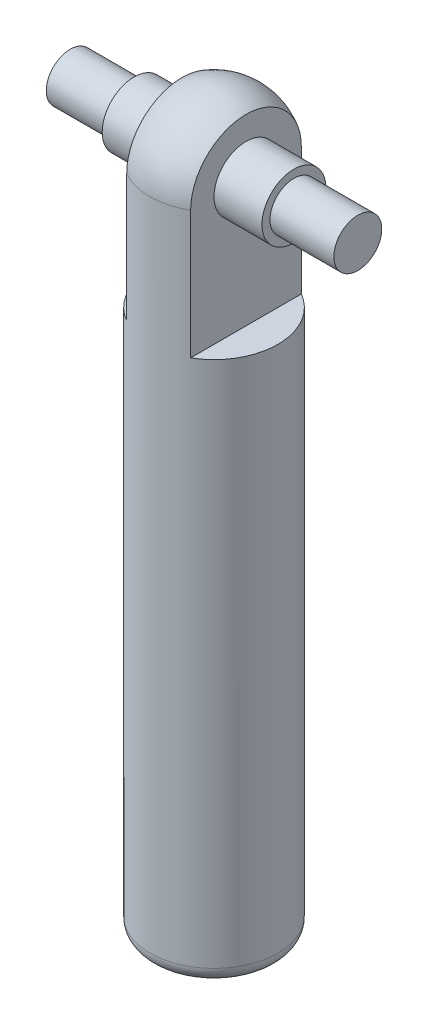
ISO-10303-21;
HEADER;
FILE_DESCRIPTION(('STEP AP214'),'2;1');
FILE_NAME('part.step','',(''),(''),'','','');
FILE_SCHEMA(('AUTOMOTIVE_DESIGN { 1 0 10303 214 1 1 1 1 }'));
ENDSEC;
DATA;
#1=APPLICATION_CONTEXT('core data for automotive mechanical design processes');
#2=APPLICATION_PROTOCOL_DEFINITION('international standard','automotive_design',2000,#1);
#3=PRODUCT_CONTEXT('',#1,'mechanical');
#4=PRODUCT('Part','Part','',(#3));
#5=PRODUCT_RELATED_PRODUCT_CATEGORY('part','',(#4));
#6=PRODUCT_DEFINITION_FORMATION('','',#4);
#7=PRODUCT_DEFINITION_CONTEXT('part definition',#1,'design');
#8=PRODUCT_DEFINITION('design','',#6,#7);
#9=PRODUCT_DEFINITION_SHAPE('','',#8);
#10=(LENGTH_UNIT() NAMED_UNIT(*) SI_UNIT(.MILLI.,.METRE.));
#11=(NAMED_UNIT(*) PLANE_ANGLE_UNIT() SI_UNIT($,.RADIAN.));
#12=(NAMED_UNIT(*) SI_UNIT($,.STERADIAN.) SOLID_ANGLE_UNIT());
#13=UNCERTAINTY_MEASURE_WITH_UNIT(LENGTH_MEASURE(1.E-05),#10,'distance_accuracy_value','');
#14=(GEOMETRIC_REPRESENTATION_CONTEXT(3) GLOBAL_UNCERTAINTY_ASSIGNED_CONTEXT((#13)) GLOBAL_UNIT_ASSIGNED_CONTEXT((#10,
#11,#12)) REPRESENTATION_CONTEXT('',''));
#15=CARTESIAN_POINT('',(0.,0.,0.));
#16=DIRECTION('',(0.,0.,1.));
#17=DIRECTION('',(1.,0.,0.));
#18=AXIS2_PLACEMENT_3D('',#15,#16,#17);
#19=CARTESIAN_POINT('',(-9.,1.5,0.));
#20=DIRECTION('',(1.,0.,0.));
#21=DIRECTION('',(0.,0.,-1.));
#22=AXIS2_PLACEMENT_3D('',#19,#20,#21);
#23=PLANE('',#22);
#24=CARTESIAN_POINT('',(-9.,0.,0.));
#25=DIRECTION('',(-1.,0.,0.));
#26=DIRECTION('',(0.,0.,1.));
#27=AXIS2_PLACEMENT_3D('',#24,#25,#26);
#28=CIRCLE('',#27,1.5);
#29=CARTESIAN_POINT('',(-9.,0.,1.5));
#30=VERTEX_POINT('',#29);
#31=EDGE_CURVE('E77',#30,#30,#28,.T.);
#32=ORIENTED_EDGE('',*,*,#31,.T.);
#33=EDGE_LOOP('',(#32));
#34=FACE_BOUND('',#33,.T.);
#35=ADVANCED_FACE('F55',(#34),#23,.F.);
#36=CARTESIAN_POINT('',(9.,0.,0.));
#37=DIRECTION('',(-1.,0.,0.));
#38=DIRECTION('',(0.,0.,1.));
#39=AXIS2_PLACEMENT_3D('',#36,#37,#38);
#40=PLANE('',#39);
#41=CARTESIAN_POINT('',(9.,0.,0.));
#42=DIRECTION('',(-1.,0.,0.));
#43=DIRECTION('',(0.,0.,1.));
#44=AXIS2_PLACEMENT_3D('',#41,#42,#43);
#45=CIRCLE('',#44,1.5);
#46=CARTESIAN_POINT('',(9.,0.,1.5));
#47=VERTEX_POINT('',#46);
#48=EDGE_CURVE('E11',#47,#47,#45,.T.);
#49=ORIENTED_EDGE('',*,*,#48,.F.);
#50=EDGE_LOOP('',(#49));
#51=FACE_BOUND('',#50,.T.);
#52=ADVANCED_FACE('F107',(#51),#40,.F.);
#53=CARTESIAN_POINT('',(-9.,0.,0.));
#54=DIRECTION('',(-1.,0.,0.));
#55=DIRECTION('',(0.,0.,1.));
#56=AXIS2_PLACEMENT_3D('',#53,#54,#55);
#57=CYLINDRICAL_SURFACE('',#56,1.5);
#58=CARTESIAN_POINT('',(5.,0.,0.));
#59=DIRECTION('',(-1.,0.,0.));
#60=DIRECTION('',(0.,0.,1.));
#61=AXIS2_PLACEMENT_3D('',#58,#59,#60);
#62=CIRCLE('',#61,1.5);
#63=CARTESIAN_POINT('',(5.,0.,1.5));
#64=VERTEX_POINT('',#63);
#65=EDGE_CURVE('E61',#64,#64,#62,.T.);
#66=ORIENTED_EDGE('',*,*,#65,.F.);
#67=EDGE_LOOP('',(#66));
#68=FACE_BOUND('',#67,.T.);
#69=ORIENTED_EDGE('',*,*,#48,.T.);
#70=EDGE_LOOP('',(#69));
#71=FACE_BOUND('',#70,.T.);
#72=ADVANCED_FACE('F102',(#68,#71),#57,.T.);
#73=CARTESIAN_POINT('',(5.,1.5,0.));
#74=DIRECTION('',(-1.,0.,0.));
#75=DIRECTION('',(0.,0.,1.));
#76=AXIS2_PLACEMENT_3D('',#73,#74,#75);
#77=PLANE('',#76);
#78=CARTESIAN_POINT('',(5.,0.,0.));
#79=DIRECTION('',(-1.,0.,0.));
#80=DIRECTION('',(0.,0.,1.));
#81=AXIS2_PLACEMENT_3D('',#78,#79,#80);
#82=CIRCLE('',#81,2.);
#83=CARTESIAN_POINT('',(5.,0.,2.));
#84=VERTEX_POINT('',#83);
#85=EDGE_CURVE('E65',#84,#84,#82,.T.);
#86=ORIENTED_EDGE('',*,*,#85,.F.);
#87=EDGE_LOOP('',(#86));
#88=FACE_BOUND('',#87,.T.);
#89=ORIENTED_EDGE('',*,*,#65,.T.);
#90=EDGE_LOOP('',(#89));
#91=FACE_BOUND('',#90,.T.);
#92=ADVANCED_FACE('F97',(#88,#91),#77,.F.);
#93=CARTESIAN_POINT('',(-9.,0.,0.));
#94=DIRECTION('',(-1.,0.,0.));
#95=DIRECTION('',(0.,0.,1.));
#96=AXIS2_PLACEMENT_3D('',#93,#94,#95);
#97=CYLINDRICAL_SURFACE('',#96,2.);
#98=CARTESIAN_POINT('',(-5.,0.,0.));
#99=DIRECTION('',(-1.,0.,0.));
#100=DIRECTION('',(0.,0.,1.));
#101=AXIS2_PLACEMENT_3D('',#98,#99,#100);
#102=CIRCLE('',#101,2.);
#103=CARTESIAN_POINT('',(-5.,0.,2.));
#104=VERTEX_POINT('',#103);
#105=EDGE_CURVE('E69',#104,#104,#102,.T.);
#106=ORIENTED_EDGE('',*,*,#105,.F.);
#107=EDGE_LOOP('',(#106));
#108=FACE_BOUND('',#107,.T.);
#109=ORIENTED_EDGE('',*,*,#85,.T.);
#110=EDGE_LOOP('',(#109));
#111=FACE_BOUND('',#110,.T.);
#112=ADVANCED_FACE('F91',(#108,#111),#97,.T.);
#113=CARTESIAN_POINT('',(-5.,2.,0.));
#114=DIRECTION('',(1.,0.,0.));
#115=DIRECTION('',(0.,0.,-1.));
#116=AXIS2_PLACEMENT_3D('',#113,#114,#115);
#117=PLANE('',#116);
#118=CARTESIAN_POINT('',(-5.,0.,0.));
#119=DIRECTION('',(-1.,0.,0.));
#120=DIRECTION('',(0.,0.,1.));
#121=AXIS2_PLACEMENT_3D('',#118,#119,#120);
#122=CIRCLE('',#121,1.5);
#123=CARTESIAN_POINT('',(-5.,0.,1.5));
#124=VERTEX_POINT('',#123);
#125=EDGE_CURVE('E74',#124,#124,#122,.T.);
#126=ORIENTED_EDGE('',*,*,#125,.F.);
#127=EDGE_LOOP('',(#126));
#128=FACE_BOUND('',#127,.T.);
#129=ORIENTED_EDGE('',*,*,#105,.T.);
#130=EDGE_LOOP('',(#129));
#131=FACE_BOUND('',#130,.T.);
#132=ADVANCED_FACE('F85',(#128,#131),#117,.F.);
#133=CARTESIAN_POINT('',(-9.,0.,0.));
#134=DIRECTION('',(-1.,0.,0.));
#135=DIRECTION('',(0.,0.,1.));
#136=AXIS2_PLACEMENT_3D('',#133,#134,#135);
#137=CYLINDRICAL_SURFACE('',#136,1.5);
#138=ORIENTED_EDGE('',*,*,#31,.F.);
#139=EDGE_LOOP('',(#138));
#140=FACE_BOUND('',#139,.T.);
#141=ORIENTED_EDGE('',*,*,#125,.T.);
#142=EDGE_LOOP('',(#141));
#143=FACE_BOUND('',#142,.T.);
#144=ADVANCED_FACE('F82',(#140,#143),#137,.T.);
#145=CLOSED_SHELL('',(#35,#52,#72,#92,#112,#132,#144));
#146=MANIFOLD_SOLID_BREP('B2',#145);
#147=CARTESIAN_POINT('',(0.,0.,0.));
#148=DIRECTION('',(0.,-1.,0.));
#149=DIRECTION('',(1.,0.,0.));
#150=AXIS2_PLACEMENT_3D('',#147,#148,#149);
#151=SPHERICAL_SURFACE('',#150,4.);
#152=CARTESIAN_POINT('',(0.,0.,0.));
#153=DIRECTION('',(0.,-1.,0.));
#154=DIRECTION('',(0.,0.,-1.));
#155=AXIS2_PLACEMENT_3D('',#152,#153,#154);
#156=CIRCLE('',#155,4.);
#157=CARTESIAN_POINT('',(2.,0.,3.46410161513776));
#158=VERTEX_POINT('',#157);
#159=CARTESIAN_POINT('',(-2.,0.,3.46410161513776));
#160=VERTEX_POINT('',#159);
#161=EDGE_CURVE('E53',#158,#160,#156,.T.);
#162=ORIENTED_EDGE('',*,*,#161,.F.);
#163=CARTESIAN_POINT('',(2.,0.,0.));
#164=DIRECTION('',(1.,0.,0.));
#165=DIRECTION('',(0.,0.,-1.));
#166=AXIS2_PLACEMENT_3D('',#163,#164,#165);
#167=CIRCLE('',#166,3.46410161513775);
#168=CARTESIAN_POINT('',(2.,0.,-3.46410161513776));
#169=VERTEX_POINT('',#168);
#170=EDGE_CURVE('E265',#158,#169,#167,.F.);
#171=ORIENTED_EDGE('',*,*,#170,.T.);
#172=CARTESIAN_POINT('',(-2.,0.,-3.46410161513776));
#173=VERTEX_POINT('',#172);
#174=EDGE_CURVE('E191',#173,#169,#156,.T.);
#175=ORIENTED_EDGE('',*,*,#174,.F.);
#176=CARTESIAN_POINT('',(-2.,0.,0.));
#177=DIRECTION('',(-1.,0.,0.));
#178=DIRECTION('',(0.,0.,1.));
#179=AXIS2_PLACEMENT_3D('',#176,#177,#178);
#180=CIRCLE('',#179,3.46410161513775);
#181=EDGE_CURVE('E249',#173,#160,#180,.F.);
#182=ORIENTED_EDGE('',*,*,#181,.T.);
#183=EDGE_LOOP('',(#162,#171,#175,#182));
#184=FACE_BOUND('',#183,.T.);
#185=ADVANCED_FACE('F182',(#184),#151,.T.);
#186=CARTESIAN_POINT('',(0.,-42.,0.));
#187=DIRECTION('',(0.,-1.,0.));
#188=DIRECTION('',(0.,0.,-1.));
#189=AXIS2_PLACEMENT_3D('',#186,#187,#188);
#190=CYLINDRICAL_SURFACE('',#189,4.);
#191=CARTESIAN_POINT('',(0.,-41.,0.));
#192=DIRECTION('',(0.,-1.,0.));
#193=DIRECTION('',(0.,0.,-1.));
#194=AXIS2_PLACEMENT_3D('',#191,#192,#193);
#195=CIRCLE('',#194,4.00000000000001);
#196=CARTESIAN_POINT('',(0.,-41.,-4.00000000000001));
#197=VERTEX_POINT('',#196);
#198=EDGE_CURVE('E272',#197,#197,#195,.T.);
#199=ORIENTED_EDGE('',*,*,#198,.F.);
#200=EDGE_LOOP('',(#199));
#201=FACE_BOUND('',#200,.T.);
#202=CARTESIAN_POINT('',(0.,-8.,0.));
#203=DIRECTION('',(0.,1.,0.));
#204=DIRECTION('',(0.,0.,1.));
#205=AXIS2_PLACEMENT_3D('',#202,#203,#204);
#206=CIRCLE('',#205,4.);
#207=CARTESIAN_POINT('',(2.,-8.,3.46410161513776));
#208=VERTEX_POINT('',#207);
#209=CARTESIAN_POINT('',(2.,-8.,-3.46410161513776));
#210=VERTEX_POINT('',#209);
#211=EDGE_CURVE('E232',#208,#210,#206,.T.);
#212=ORIENTED_EDGE('',*,*,#211,.F.);
#213=DIRECTION('',(0.,1.,0.));
#214=VECTOR('',#213,1.);
#215=CARTESIAN_POINT('',(2.,-8.,3.46410161513776));
#216=LINE('',#215,#214);
#217=EDGE_CURVE('E229',#208,#158,#216,.T.);
#218=ORIENTED_EDGE('',*,*,#217,.T.);
#219=ORIENTED_EDGE('',*,*,#161,.T.);
#220=DIRECTION('',(0.,1.,0.));
#221=VECTOR('',#220,1.);
#222=CARTESIAN_POINT('',(-2.,-8.,3.46410161513776));
#223=LINE('',#222,#221);
#224=CARTESIAN_POINT('',(-2.,-8.,3.46410161513776));
#225=VERTEX_POINT('',#224);
#226=EDGE_CURVE('E233',#225,#160,#223,.T.);
#227=ORIENTED_EDGE('',*,*,#226,.F.);
#228=CARTESIAN_POINT('',(0.,-8.,0.));
#229=DIRECTION('',(0.,1.,0.));
#230=DIRECTION('',(0.,0.,1.));
#231=AXIS2_PLACEMENT_3D('',#228,#229,#230);
#232=CIRCLE('',#231,4.);
#233=CARTESIAN_POINT('',(-2.,-8.,-3.46410161513776));
#234=VERTEX_POINT('',#233);
#235=EDGE_CURVE('E254',#234,#225,#232,.T.);
#236=ORIENTED_EDGE('',*,*,#235,.F.);
#237=DIRECTION('',(0.,1.,0.));
#238=VECTOR('',#237,1.);
#239=CARTESIAN_POINT('',(-2.,-8.,-3.46410161513776));
#240=LINE('',#239,#238);
#241=EDGE_CURVE('E257',#234,#173,#240,.T.);
#242=ORIENTED_EDGE('',*,*,#241,.T.);
#243=ORIENTED_EDGE('',*,*,#174,.T.);
#244=DIRECTION('',(0.,1.,0.));
#245=VECTOR('',#244,1.);
#246=CARTESIAN_POINT('',(2.,-8.,-3.46410161513776));
#247=LINE('',#246,#245);
#248=EDGE_CURVE('E226',#210,#169,#247,.T.);
#249=ORIENTED_EDGE('',*,*,#248,.F.);
#250=EDGE_LOOP('',(#212,#218,#219,#227,#236,#242,#243,#249));
#251=FACE_BOUND('',#250,.T.);
#252=ADVANCED_FACE('F240',(#201,#251),#190,.T.);
#253=CARTESIAN_POINT('',(0.,-41.,0.));
#254=DIRECTION('',(0.,-1.,0.));
#255=DIRECTION('',(0.,0.,-1.));
#256=AXIS2_PLACEMENT_3D('',#253,#254,#255);
#257=TOROIDAL_SURFACE('',#256,3.00000000000001,1.);
#258=ORIENTED_EDGE('',*,*,#198,.T.);
#259=EDGE_LOOP('',(#258));
#260=FACE_BOUND('',#259,.T.);
#261=CARTESIAN_POINT('',(0.,-42.,0.));
#262=DIRECTION('',(0.,-1.,0.));
#263=DIRECTION('',(0.,0.,-1.));
#264=AXIS2_PLACEMENT_3D('',#261,#262,#263);
#265=CIRCLE('',#264,3.);
#266=CARTESIAN_POINT('',(0.,-42.,-3.));
#267=VERTEX_POINT('',#266);
#268=EDGE_CURVE('E268',#267,#267,#265,.T.);
#269=ORIENTED_EDGE('',*,*,#268,.F.);
#270=EDGE_LOOP('',(#269));
#271=FACE_BOUND('',#270,.T.);
#272=ADVANCED_FACE('F278',(#260,#271),#257,.T.);
#273=CARTESIAN_POINT('',(3.,-42.,0.));
#274=DIRECTION('',(0.,-1.,0.));
#275=DIRECTION('',(0.,0.,-1.));
#276=AXIS2_PLACEMENT_3D('',#273,#274,#275);
#277=PLANE('',#276);
#278=ORIENTED_EDGE('',*,*,#268,.T.);
#279=EDGE_LOOP('',(#278));
#280=FACE_BOUND('',#279,.T.);
#281=ADVANCED_FACE('F286',(#280),#277,.T.);
#282=CARTESIAN_POINT('',(-2.,-8.,0.));
#283=DIRECTION('',(-1.,0.,0.));
#284=DIRECTION('',(0.,0.,1.));
#285=AXIS2_PLACEMENT_3D('',#282,#283,#284);
#286=PLANE('',#285);
#287=ORIENTED_EDGE('',*,*,#241,.F.);
#288=DIRECTION('',(0.,0.,1.));
#289=VECTOR('',#288,1.);
#290=CARTESIAN_POINT('',(-2.,-8.,0.));
#291=LINE('',#290,#289);
#292=EDGE_CURVE('E205',#234,#225,#291,.T.);
#293=ORIENTED_EDGE('',*,*,#292,.T.);
#294=ORIENTED_EDGE('',*,*,#226,.T.);
#295=ORIENTED_EDGE('',*,*,#181,.F.);
#296=EDGE_LOOP('',(#287,#293,#294,#295));
#297=FACE_BOUND('',#296,.T.);
#298=CARTESIAN_POINT('',(-2.,0.,0.));
#299=DIRECTION('',(-1.,0.,0.));
#300=DIRECTION('',(0.,0.,1.));
#301=AXIS2_PLACEMENT_3D('',#298,#299,#300);
#302=CIRCLE('',#301,2.);
#303=CARTESIAN_POINT('',(-2.,0.,2.));
#304=VERTEX_POINT('',#303);
#305=EDGE_CURVE('E244',#304,#304,#302,.F.);
#306=ORIENTED_EDGE('',*,*,#305,.T.);
#307=EDGE_LOOP('',(#306));
#308=FACE_BOUND('',#307,.T.);
#309=ADVANCED_FACE('F292',(#297,#308),#286,.T.);
#310=CARTESIAN_POINT('',(0.,-8.,0.));
#311=DIRECTION('',(0.,1.,0.));
#312=DIRECTION('',(0.,0.,1.));
#313=AXIS2_PLACEMENT_3D('',#310,#311,#312);
#314=PLANE('',#313);
#315=ORIENTED_EDGE('',*,*,#292,.F.);
#316=ORIENTED_EDGE('',*,*,#235,.T.);
#317=EDGE_LOOP('',(#315,#316));
#318=FACE_BOUND('',#317,.T.);
#319=ADVANCED_FACE('F300',(#318),#314,.T.);
#320=CARTESIAN_POINT('',(2.,-8.,0.));
#321=DIRECTION('',(1.,0.,0.));
#322=DIRECTION('',(0.,0.,-1.));
#323=AXIS2_PLACEMENT_3D('',#320,#321,#322);
#324=PLANE('',#323);
#325=ORIENTED_EDGE('',*,*,#217,.F.);
#326=DIRECTION('',(0.,0.,-1.));
#327=VECTOR('',#326,1.);
#328=CARTESIAN_POINT('',(2.,-8.,0.));
#329=LINE('',#328,#327);
#330=EDGE_CURVE('E198',#208,#210,#329,.T.);
#331=ORIENTED_EDGE('',*,*,#330,.T.);
#332=ORIENTED_EDGE('',*,*,#248,.T.);
#333=ORIENTED_EDGE('',*,*,#170,.F.);
#334=EDGE_LOOP('',(#325,#331,#332,#333));
#335=FACE_BOUND('',#334,.T.);
#336=CARTESIAN_POINT('',(2.,0.,0.));
#337=DIRECTION('',(1.,0.,0.));
#338=DIRECTION('',(0.,0.,-1.));
#339=AXIS2_PLACEMENT_3D('',#336,#337,#338);
#340=CIRCLE('',#339,2.);
#341=CARTESIAN_POINT('',(2.,0.,-2.));
#342=VERTEX_POINT('',#341);
#343=EDGE_CURVE('E185',#342,#342,#340,.F.);
#344=ORIENTED_EDGE('',*,*,#343,.T.);
#345=EDGE_LOOP('',(#344));
#346=FACE_BOUND('',#345,.T.);
#347=ADVANCED_FACE('F223',(#335,#346),#324,.T.);
#348=CARTESIAN_POINT('',(0.,-8.,0.));
#349=DIRECTION('',(0.,1.,0.));
#350=DIRECTION('',(0.,0.,1.));
#351=AXIS2_PLACEMENT_3D('',#348,#349,#350);
#352=PLANE('',#351);
#353=ORIENTED_EDGE('',*,*,#330,.F.);
#354=ORIENTED_EDGE('',*,*,#211,.T.);
#355=EDGE_LOOP('',(#353,#354));
#356=FACE_BOUND('',#355,.T.);
#357=ADVANCED_FACE('F235',(#356),#352,.T.);
#358=CARTESIAN_POINT('',(-4.00000000000001,0.,0.));
#359=DIRECTION('',(1.,0.,0.));
#360=DIRECTION('',(0.,0.,-1.));
#361=AXIS2_PLACEMENT_3D('',#358,#359,#360);
#362=CYLINDRICAL_SURFACE('',#361,2.);
#363=ORIENTED_EDGE('',*,*,#305,.F.);
#364=EDGE_LOOP('',(#363));
#365=FACE_BOUND('',#364,.T.);
#366=ORIENTED_EDGE('',*,*,#343,.F.);
#367=EDGE_LOOP('',(#366));
#368=FACE_BOUND('',#367,.T.);
#369=ADVANCED_FACE('F294',(#365,#368),#362,.F.);
#370=CLOSED_SHELL('',(#185,#252,#272,#281,#309,#319,#347,#357,#369));
#371=MANIFOLD_SOLID_BREP('B6',#370);
#372=ADVANCED_BREP_SHAPE_REPRESENTATION('',(#18,#146,#371),#14);
#373=SHAPE_DEFINITION_REPRESENTATION(#9,#372);
ENDSEC;
END-ISO-10303-21;
